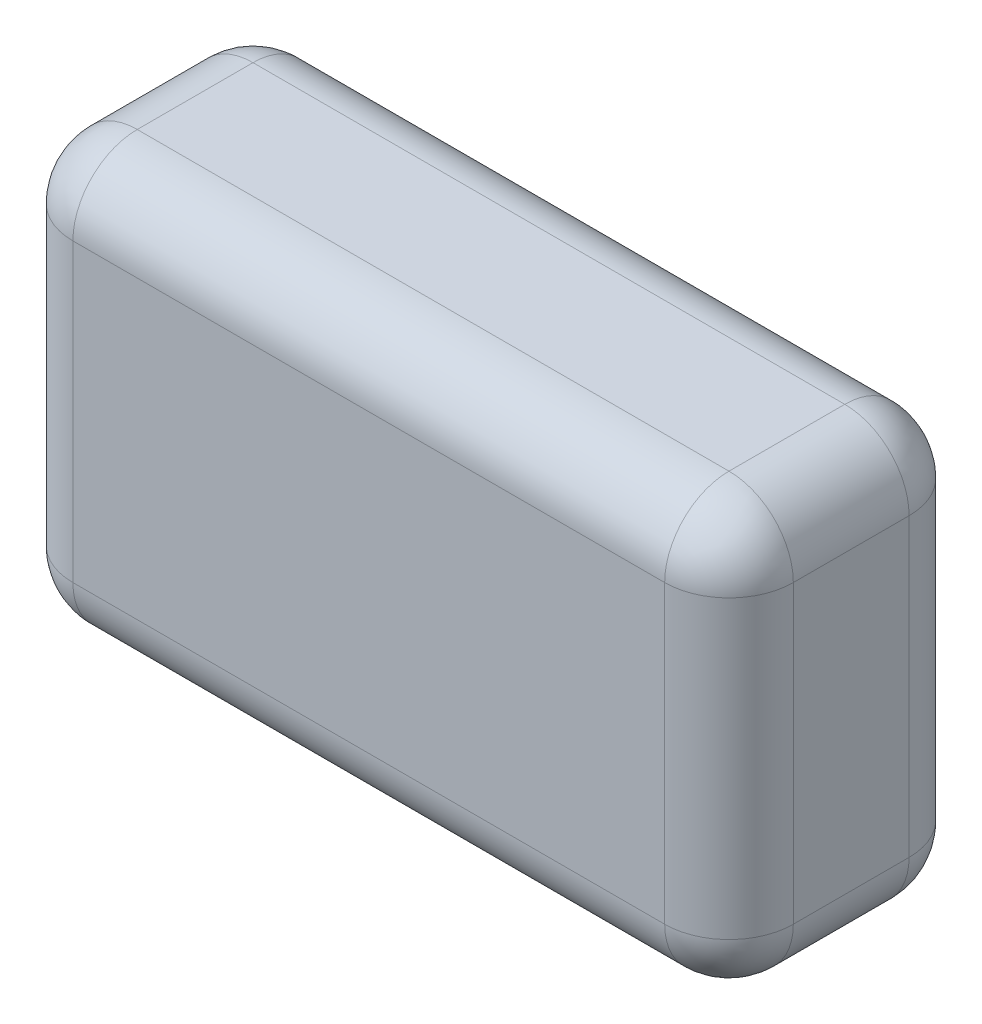
ISO-10303-21;
HEADER;
FILE_DESCRIPTION(('STEP AP214'),'2;1');
FILE_NAME('part.step','',(''),(''),'','','');
FILE_SCHEMA(('AUTOMOTIVE_DESIGN { 1 0 10303 214 1 1 1 1 }'));
ENDSEC;
DATA;
#1=APPLICATION_CONTEXT('core data for automotive mechanical design processes');
#2=APPLICATION_PROTOCOL_DEFINITION('international standard','automotive_design',2000,#1);
#3=PRODUCT_CONTEXT('',#1,'mechanical');
#4=PRODUCT('Part','Part','',(#3));
#5=PRODUCT_RELATED_PRODUCT_CATEGORY('part','',(#4));
#6=PRODUCT_DEFINITION_FORMATION('','',#4);
#7=PRODUCT_DEFINITION_CONTEXT('part definition',#1,'design');
#8=PRODUCT_DEFINITION('design','',#6,#7);
#9=PRODUCT_DEFINITION_SHAPE('','',#8);
#10=(LENGTH_UNIT() NAMED_UNIT(*) SI_UNIT(.MILLI.,.METRE.));
#11=(NAMED_UNIT(*) PLANE_ANGLE_UNIT() SI_UNIT($,.RADIAN.));
#12=(NAMED_UNIT(*) SI_UNIT($,.STERADIAN.) SOLID_ANGLE_UNIT());
#13=UNCERTAINTY_MEASURE_WITH_UNIT(LENGTH_MEASURE(1.E-05),#10,'distance_accuracy_value','');
#14=(GEOMETRIC_REPRESENTATION_CONTEXT(3) GLOBAL_UNCERTAINTY_ASSIGNED_CONTEXT((#13)) GLOBAL_UNIT_ASSIGNED_CONTEXT((#10,
#11,#12)) REPRESENTATION_CONTEXT('',''));
#15=CARTESIAN_POINT('',(0.,0.,0.));
#16=DIRECTION('',(0.,0.,1.));
#17=DIRECTION('',(1.,0.,0.));
#18=AXIS2_PLACEMENT_3D('',#15,#16,#17);
#19=CARTESIAN_POINT('',(46.,23.,38.));
#20=DIRECTION('',(0.,0.,-1.));
#21=DIRECTION('',(-1.,0.,0.));
#22=AXIS2_PLACEMENT_3D('',#19,#20,#21);
#23=CYLINDRICAL_SURFACE('',#22,10.);
#24=DIRECTION('',(0.,0.,-1.));
#25=VECTOR('',#24,1.);
#26=CARTESIAN_POINT('',(56.,23.,38.));
#27=LINE('',#26,#25);
#28=CARTESIAN_POINT('',(56.,23.,28.));
#29=VERTEX_POINT('',#28);
#30=CARTESIAN_POINT('',(56.,23.,10.));
#31=VERTEX_POINT('',#30);
#32=EDGE_CURVE('E261',#29,#31,#27,.T.);
#33=ORIENTED_EDGE('',*,*,#32,.T.);
#34=CARTESIAN_POINT('',(46.,23.,10.));
#35=DIRECTION('',(0.,0.,-1.));
#36=DIRECTION('',(-1.,0.,0.));
#37=AXIS2_PLACEMENT_3D('',#34,#35,#36);
#38=CIRCLE('',#37,10.);
#39=CARTESIAN_POINT('',(46.,33.,10.));
#40=VERTEX_POINT('',#39);
#41=EDGE_CURVE('E151',#31,#40,#38,.F.);
#42=ORIENTED_EDGE('',*,*,#41,.T.);
#43=DIRECTION('',(0.,0.,-1.));
#44=VECTOR('',#43,1.);
#45=CARTESIAN_POINT('',(46.,33.,38.));
#46=LINE('',#45,#44);
#47=CARTESIAN_POINT('',(46.,33.,28.));
#48=VERTEX_POINT('',#47);
#49=EDGE_CURVE('E133',#48,#40,#46,.T.);
#50=ORIENTED_EDGE('',*,*,#49,.F.);
#51=CARTESIAN_POINT('',(46.,23.,28.));
#52=DIRECTION('',(0.,0.,-1.));
#53=DIRECTION('',(-1.,0.,0.));
#54=AXIS2_PLACEMENT_3D('',#51,#52,#53);
#55=CIRCLE('',#54,10.);
#56=EDGE_CURVE('E148',#48,#29,#55,.T.);
#57=ORIENTED_EDGE('',*,*,#56,.T.);
#58=EDGE_LOOP('',(#33,#42,#50,#57));
#59=FACE_BOUND('',#58,.T.);
#60=ADVANCED_FACE('F39',(#59),#23,.T.);
#61=CARTESIAN_POINT('',(-46.,33.,38.));
#62=DIRECTION('',(0.,-1.,0.));
#63=DIRECTION('',(1.,0.,0.));
#64=AXIS2_PLACEMENT_3D('',#61,#62,#63);
#65=PLANE('',#64);
#66=ORIENTED_EDGE('',*,*,#49,.T.);
#67=DIRECTION('',(-1.,0.,0.));
#68=VECTOR('',#67,1.);
#69=CARTESIAN_POINT('',(-46.,33.,10.));
#70=LINE('',#69,#68);
#71=CARTESIAN_POINT('',(-46.,33.,10.));
#72=VERTEX_POINT('',#71);
#73=EDGE_CURVE('E141',#40,#72,#70,.T.);
#74=ORIENTED_EDGE('',*,*,#73,.T.);
#75=DIRECTION('',(0.,0.,-1.));
#76=VECTOR('',#75,1.);
#77=CARTESIAN_POINT('',(-46.,33.,38.));
#78=LINE('',#77,#76);
#79=CARTESIAN_POINT('',(-46.,33.,28.));
#80=VERTEX_POINT('',#79);
#81=EDGE_CURVE('E135',#80,#72,#78,.T.);
#82=ORIENTED_EDGE('',*,*,#81,.F.);
#83=DIRECTION('',(-1.,0.,0.));
#84=VECTOR('',#83,1.);
#85=CARTESIAN_POINT('',(-46.,33.,28.));
#86=LINE('',#85,#84);
#87=EDGE_CURVE('E130',#80,#48,#86,.F.);
#88=ORIENTED_EDGE('',*,*,#87,.T.);
#89=EDGE_LOOP('',(#66,#74,#82,#88));
#90=FACE_BOUND('',#89,.T.);
#91=ADVANCED_FACE('F132',(#90),#65,.F.);
#92=CARTESIAN_POINT('',(-46.,23.,38.));
#93=DIRECTION('',(0.,0.,-1.));
#94=DIRECTION('',(-1.,0.,0.));
#95=AXIS2_PLACEMENT_3D('',#92,#93,#94);
#96=CYLINDRICAL_SURFACE('',#95,10.);
#97=ORIENTED_EDGE('',*,*,#81,.T.);
#98=CARTESIAN_POINT('',(-46.,23.,10.));
#99=DIRECTION('',(0.,0.,-1.));
#100=DIRECTION('',(-1.,0.,0.));
#101=AXIS2_PLACEMENT_3D('',#98,#99,#100);
#102=CIRCLE('',#101,10.);
#103=CARTESIAN_POINT('',(-56.,23.,10.));
#104=VERTEX_POINT('',#103);
#105=EDGE_CURVE('E188',#72,#104,#102,.F.);
#106=ORIENTED_EDGE('',*,*,#105,.T.);
#107=DIRECTION('',(0.,0.,-1.));
#108=VECTOR('',#107,1.);
#109=CARTESIAN_POINT('',(-56.,23.,38.));
#110=LINE('',#109,#108);
#111=CARTESIAN_POINT('',(-56.,23.,28.));
#112=VERTEX_POINT('',#111);
#113=EDGE_CURVE('E294',#112,#104,#110,.T.);
#114=ORIENTED_EDGE('',*,*,#113,.F.);
#115=CARTESIAN_POINT('',(-46.,23.,28.));
#116=DIRECTION('',(0.,0.,-1.));
#117=DIRECTION('',(-1.,0.,0.));
#118=AXIS2_PLACEMENT_3D('',#115,#116,#117);
#119=CIRCLE('',#118,10.);
#120=EDGE_CURVE('E185',#112,#80,#119,.T.);
#121=ORIENTED_EDGE('',*,*,#120,.T.);
#122=EDGE_LOOP('',(#97,#106,#114,#121));
#123=FACE_BOUND('',#122,.T.);
#124=ADVANCED_FACE('F299',(#123),#96,.T.);
#125=CARTESIAN_POINT('',(-56.,23.,38.));
#126=DIRECTION('',(1.,0.,0.));
#127=DIRECTION('',(0.,0.,-1.));
#128=AXIS2_PLACEMENT_3D('',#125,#126,#127);
#129=PLANE('',#128);
#130=ORIENTED_EDGE('',*,*,#113,.T.);
#131=DIRECTION('',(0.,-1.,0.));
#132=VECTOR('',#131,1.);
#133=CARTESIAN_POINT('',(-56.,-23.,10.));
#134=LINE('',#133,#132);
#135=CARTESIAN_POINT('',(-56.,-23.,10.));
#136=VERTEX_POINT('',#135);
#137=EDGE_CURVE('E194',#104,#136,#134,.T.);
#138=ORIENTED_EDGE('',*,*,#137,.T.);
#139=DIRECTION('',(0.,0.,-1.));
#140=VECTOR('',#139,1.);
#141=CARTESIAN_POINT('',(-56.,-23.,38.));
#142=LINE('',#141,#140);
#143=CARTESIAN_POINT('',(-56.,-23.,28.));
#144=VERTEX_POINT('',#143);
#145=EDGE_CURVE('E297',#144,#136,#142,.T.);
#146=ORIENTED_EDGE('',*,*,#145,.F.);
#147=DIRECTION('',(0.,-1.,0.));
#148=VECTOR('',#147,1.);
#149=CARTESIAN_POINT('',(-56.,23.,28.));
#150=LINE('',#149,#148);
#151=EDGE_CURVE('E191',#144,#112,#150,.F.);
#152=ORIENTED_EDGE('',*,*,#151,.T.);
#153=EDGE_LOOP('',(#130,#138,#146,#152));
#154=FACE_BOUND('',#153,.T.);
#155=ADVANCED_FACE('F293',(#154),#129,.F.);
#156=CARTESIAN_POINT('',(-46.,-23.,38.));
#157=DIRECTION('',(0.,0.,-1.));
#158=DIRECTION('',(-1.,0.,0.));
#159=AXIS2_PLACEMENT_3D('',#156,#157,#158);
#160=CYLINDRICAL_SURFACE('',#159,10.);
#161=ORIENTED_EDGE('',*,*,#145,.T.);
#162=CARTESIAN_POINT('',(-46.,-23.,10.));
#163=DIRECTION('',(0.,0.,-1.));
#164=DIRECTION('',(-1.,0.,0.));
#165=AXIS2_PLACEMENT_3D('',#162,#163,#164);
#166=CIRCLE('',#165,10.);
#167=CARTESIAN_POINT('',(-46.,-33.,10.));
#168=VERTEX_POINT('',#167);
#169=EDGE_CURVE('E182',#136,#168,#166,.F.);
#170=ORIENTED_EDGE('',*,*,#169,.T.);
#171=DIRECTION('',(0.,0.,-1.));
#172=VECTOR('',#171,1.);
#173=CARTESIAN_POINT('',(-46.,-33.,38.));
#174=LINE('',#173,#172);
#175=CARTESIAN_POINT('',(-46.,-33.,28.));
#176=VERTEX_POINT('',#175);
#177=EDGE_CURVE('E305',#176,#168,#174,.T.);
#178=ORIENTED_EDGE('',*,*,#177,.F.);
#179=CARTESIAN_POINT('',(-46.,-23.,28.));
#180=DIRECTION('',(0.,0.,-1.));
#181=DIRECTION('',(-1.,0.,0.));
#182=AXIS2_PLACEMENT_3D('',#179,#180,#181);
#183=CIRCLE('',#182,10.);
#184=EDGE_CURVE('E179',#176,#144,#183,.T.);
#185=ORIENTED_EDGE('',*,*,#184,.T.);
#186=EDGE_LOOP('',(#161,#170,#178,#185));
#187=FACE_BOUND('',#186,.T.);
#188=ADVANCED_FACE('F354',(#187),#160,.T.);
#189=CARTESIAN_POINT('',(-46.,-33.,38.));
#190=DIRECTION('',(0.,1.,0.));
#191=DIRECTION('',(0.,0.,1.));
#192=AXIS2_PLACEMENT_3D('',#189,#190,#191);
#193=PLANE('',#192);
#194=ORIENTED_EDGE('',*,*,#177,.T.);
#195=DIRECTION('',(1.,0.,0.));
#196=VECTOR('',#195,1.);
#197=CARTESIAN_POINT('',(46.,-33.,10.));
#198=LINE('',#197,#196);
#199=CARTESIAN_POINT('',(46.,-33.,10.));
#200=VERTEX_POINT('',#199);
#201=EDGE_CURVE('E221',#168,#200,#198,.T.);
#202=ORIENTED_EDGE('',*,*,#201,.T.);
#203=DIRECTION('',(0.,0.,-1.));
#204=VECTOR('',#203,1.);
#205=CARTESIAN_POINT('',(46.,-33.,38.));
#206=LINE('',#205,#204);
#207=CARTESIAN_POINT('',(46.,-33.,28.));
#208=VERTEX_POINT('',#207);
#209=EDGE_CURVE('E311',#208,#200,#206,.T.);
#210=ORIENTED_EDGE('',*,*,#209,.F.);
#211=DIRECTION('',(1.,0.,0.));
#212=VECTOR('',#211,1.);
#213=CARTESIAN_POINT('',(-46.,-33.,28.));
#214=LINE('',#213,#212);
#215=EDGE_CURVE('E218',#208,#176,#214,.F.);
#216=ORIENTED_EDGE('',*,*,#215,.T.);
#217=EDGE_LOOP('',(#194,#202,#210,#216));
#218=FACE_BOUND('',#217,.T.);
#219=ADVANCED_FACE('F356',(#218),#193,.F.);
#220=CARTESIAN_POINT('',(46.,-23.,38.));
#221=DIRECTION('',(0.,0.,-1.));
#222=DIRECTION('',(-1.,0.,0.));
#223=AXIS2_PLACEMENT_3D('',#220,#221,#222);
#224=CYLINDRICAL_SURFACE('',#223,10.);
#225=ORIENTED_EDGE('',*,*,#209,.T.);
#226=CARTESIAN_POINT('',(46.,-23.,10.));
#227=DIRECTION('',(0.,0.,-1.));
#228=DIRECTION('',(-1.,0.,0.));
#229=AXIS2_PLACEMENT_3D('',#226,#227,#228);
#230=CIRCLE('',#229,10.);
#231=CARTESIAN_POINT('',(56.,-23.,10.));
#232=VERTEX_POINT('',#231);
#233=EDGE_CURVE('E176',#200,#232,#230,.F.);
#234=ORIENTED_EDGE('',*,*,#233,.T.);
#235=DIRECTION('',(0.,0.,-1.));
#236=VECTOR('',#235,1.);
#237=CARTESIAN_POINT('',(56.,-23.,38.));
#238=LINE('',#237,#236);
#239=CARTESIAN_POINT('',(56.,-23.,28.));
#240=VERTEX_POINT('',#239);
#241=EDGE_CURVE('E315',#240,#232,#238,.T.);
#242=ORIENTED_EDGE('',*,*,#241,.F.);
#243=CARTESIAN_POINT('',(46.,-23.,28.));
#244=DIRECTION('',(0.,0.,-1.));
#245=DIRECTION('',(-1.,0.,0.));
#246=AXIS2_PLACEMENT_3D('',#243,#244,#245);
#247=CIRCLE('',#246,10.);
#248=EDGE_CURVE('E170',#240,#208,#247,.T.);
#249=ORIENTED_EDGE('',*,*,#248,.T.);
#250=EDGE_LOOP('',(#225,#234,#242,#249));
#251=FACE_BOUND('',#250,.T.);
#252=ADVANCED_FACE('F377',(#251),#224,.T.);
#253=CARTESIAN_POINT('',(56.,23.,38.));
#254=DIRECTION('',(-1.,0.,0.));
#255=DIRECTION('',(0.,-1.,0.));
#256=AXIS2_PLACEMENT_3D('',#253,#254,#255);
#257=PLANE('',#256);
#258=ORIENTED_EDGE('',*,*,#241,.T.);
#259=DIRECTION('',(0.,1.,0.));
#260=VECTOR('',#259,1.);
#261=CARTESIAN_POINT('',(56.,23.,10.));
#262=LINE('',#261,#260);
#263=EDGE_CURVE('E215',#232,#31,#262,.T.);
#264=ORIENTED_EDGE('',*,*,#263,.T.);
#265=ORIENTED_EDGE('',*,*,#32,.F.);
#266=DIRECTION('',(0.,1.,0.));
#267=VECTOR('',#266,1.);
#268=CARTESIAN_POINT('',(56.,23.,28.));
#269=LINE('',#268,#267);
#270=EDGE_CURVE('E211',#29,#240,#269,.F.);
#271=ORIENTED_EDGE('',*,*,#270,.T.);
#272=EDGE_LOOP('',(#258,#264,#265,#271));
#273=FACE_BOUND('',#272,.T.);
#274=ADVANCED_FACE('F370',(#273),#257,.F.);
#275=CARTESIAN_POINT('',(46.,23.,38.));
#276=DIRECTION('',(0.,0.,-1.));
#277=DIRECTION('',(-1.,0.,0.));
#278=AXIS2_PLACEMENT_3D('',#275,#276,#277);
#279=PLANE('',#278);
#280=DIRECTION('',(1.,0.,0.));
#281=VECTOR('',#280,1.);
#282=CARTESIAN_POINT('',(46.,-23.,38.));
#283=LINE('',#282,#281);
#284=CARTESIAN_POINT('',(-46.,-23.,38.));
#285=VERTEX_POINT('',#284);
#286=CARTESIAN_POINT('',(46.,-23.,38.));
#287=VERTEX_POINT('',#286);
#288=EDGE_CURVE('E49',#285,#287,#283,.T.);
#289=ORIENTED_EDGE('',*,*,#288,.T.);
#290=DIRECTION('',(0.,1.,0.));
#291=VECTOR('',#290,1.);
#292=CARTESIAN_POINT('',(46.,23.,38.));
#293=LINE('',#292,#291);
#294=CARTESIAN_POINT('',(46.,23.,38.));
#295=VERTEX_POINT('',#294);
#296=EDGE_CURVE('E11',#287,#295,#293,.T.);
#297=ORIENTED_EDGE('',*,*,#296,.T.);
#298=DIRECTION('',(-1.,0.,0.));
#299=VECTOR('',#298,1.);
#300=CARTESIAN_POINT('',(46.,23.,38.));
#301=LINE('',#300,#299);
#302=CARTESIAN_POINT('',(-46.,23.,38.));
#303=VERTEX_POINT('',#302);
#304=EDGE_CURVE('E158',#295,#303,#301,.T.);
#305=ORIENTED_EDGE('',*,*,#304,.T.);
#306=DIRECTION('',(0.,-1.,0.));
#307=VECTOR('',#306,1.);
#308=CARTESIAN_POINT('',(-46.,23.,38.));
#309=LINE('',#308,#307);
#310=EDGE_CURVE('E60',#303,#285,#309,.T.);
#311=ORIENTED_EDGE('',*,*,#310,.T.);
#312=EDGE_LOOP('',(#289,#297,#305,#311));
#313=FACE_BOUND('',#312,.T.);
#314=ADVANCED_FACE('F368',(#313),#279,.F.);
#315=CARTESIAN_POINT('',(46.,23.,0.));
#316=DIRECTION('',(0.,0.,-1.));
#317=DIRECTION('',(-1.,0.,0.));
#318=AXIS2_PLACEMENT_3D('',#315,#316,#317);
#319=PLANE('',#318);
#320=DIRECTION('',(1.,0.,0.));
#321=VECTOR('',#320,1.);
#322=CARTESIAN_POINT('',(-46.,-23.,0.));
#323=LINE('',#322,#321);
#324=CARTESIAN_POINT('',(46.,-23.,0.));
#325=VERTEX_POINT('',#324);
#326=CARTESIAN_POINT('',(-46.,-23.,0.));
#327=VERTEX_POINT('',#326);
#328=EDGE_CURVE('E197',#325,#327,#323,.F.);
#329=ORIENTED_EDGE('',*,*,#328,.T.);
#330=DIRECTION('',(0.,-1.,0.));
#331=VECTOR('',#330,1.);
#332=CARTESIAN_POINT('',(-46.,23.,0.));
#333=LINE('',#332,#331);
#334=CARTESIAN_POINT('',(-46.,23.,0.));
#335=VERTEX_POINT('',#334);
#336=EDGE_CURVE('E142',#327,#335,#333,.F.);
#337=ORIENTED_EDGE('',*,*,#336,.T.);
#338=DIRECTION('',(-1.,0.,0.));
#339=VECTOR('',#338,1.);
#340=CARTESIAN_POINT('',(46.,23.,0.));
#341=LINE('',#340,#339);
#342=CARTESIAN_POINT('',(46.,23.,0.));
#343=VERTEX_POINT('',#342);
#344=EDGE_CURVE('E203',#335,#343,#341,.F.);
#345=ORIENTED_EDGE('',*,*,#344,.T.);
#346=DIRECTION('',(0.,1.,0.));
#347=VECTOR('',#346,1.);
#348=CARTESIAN_POINT('',(46.,-23.,0.));
#349=LINE('',#348,#347);
#350=EDGE_CURVE('E200',#343,#325,#349,.F.);
#351=ORIENTED_EDGE('',*,*,#350,.T.);
#352=EDGE_LOOP('',(#329,#337,#345,#351));
#353=FACE_BOUND('',#352,.T.);
#354=ADVANCED_FACE('F341',(#353),#319,.T.);
#355=CARTESIAN_POINT('',(-46.,-23.,10.));
#356=DIRECTION('',(0.,0.,-1.));
#357=DIRECTION('',(-1.,0.,0.));
#358=AXIS2_PLACEMENT_3D('',#355,#356,#357);
#359=SPHERICAL_SURFACE('',#358,10.);
#360=CARTESIAN_POINT('',(-46.,-23.,10.));
#361=DIRECTION('',(0.,1.,0.));
#362=DIRECTION('',(0.,0.,1.));
#363=AXIS2_PLACEMENT_3D('',#360,#361,#362);
#364=CIRCLE('',#363,10.);
#365=EDGE_CURVE('E253',#327,#136,#364,.T.);
#366=ORIENTED_EDGE('',*,*,#365,.F.);
#367=CARTESIAN_POINT('',(-46.,-23.,10.));
#368=DIRECTION('',(1.,0.,0.));
#369=DIRECTION('',(0.,0.,-1.));
#370=AXIS2_PLACEMENT_3D('',#367,#368,#369);
#371=CIRCLE('',#370,10.);
#372=EDGE_CURVE('E257',#168,#327,#371,.T.);
#373=ORIENTED_EDGE('',*,*,#372,.F.);
#374=ORIENTED_EDGE('',*,*,#169,.F.);
#375=EDGE_LOOP('',(#366,#373,#374));
#376=FACE_BOUND('',#375,.T.);
#377=ADVANCED_FACE('F351',(#376),#359,.T.);
#378=CARTESIAN_POINT('',(-46.,-23.,10.));
#379=DIRECTION('',(-1.,0.,0.));
#380=DIRECTION('',(0.,0.,1.));
#381=AXIS2_PLACEMENT_3D('',#378,#379,#380);
#382=CYLINDRICAL_SURFACE('',#381,10.);
#383=ORIENTED_EDGE('',*,*,#372,.T.);
#384=ORIENTED_EDGE('',*,*,#328,.F.);
#385=CARTESIAN_POINT('',(46.,-23.,10.));
#386=DIRECTION('',(1.,0.,0.));
#387=DIRECTION('',(0.,0.,-1.));
#388=AXIS2_PLACEMENT_3D('',#385,#386,#387);
#389=CIRCLE('',#388,10.);
#390=EDGE_CURVE('E249',#200,#325,#389,.T.);
#391=ORIENTED_EDGE('',*,*,#390,.F.);
#392=ORIENTED_EDGE('',*,*,#201,.F.);
#393=EDGE_LOOP('',(#383,#384,#391,#392));
#394=FACE_BOUND('',#393,.T.);
#395=ADVANCED_FACE('F348',(#394),#382,.T.);
#396=CARTESIAN_POINT('',(-46.,23.,10.));
#397=DIRECTION('',(0.,1.,0.));
#398=DIRECTION('',(0.,0.,1.));
#399=AXIS2_PLACEMENT_3D('',#396,#397,#398);
#400=CYLINDRICAL_SURFACE('',#399,10.);
#401=ORIENTED_EDGE('',*,*,#365,.T.);
#402=ORIENTED_EDGE('',*,*,#137,.F.);
#403=CARTESIAN_POINT('',(-46.,23.,10.));
#404=DIRECTION('',(0.,1.,0.));
#405=DIRECTION('',(0.,0.,1.));
#406=AXIS2_PLACEMENT_3D('',#403,#404,#405);
#407=CIRCLE('',#406,10.);
#408=EDGE_CURVE('E245',#335,#104,#407,.T.);
#409=ORIENTED_EDGE('',*,*,#408,.F.);
#410=ORIENTED_EDGE('',*,*,#336,.F.);
#411=EDGE_LOOP('',(#401,#402,#409,#410));
#412=FACE_BOUND('',#411,.T.);
#413=ADVANCED_FACE('F339',(#412),#400,.T.);
#414=CARTESIAN_POINT('',(46.,-23.,10.));
#415=DIRECTION('',(0.,0.,-1.));
#416=DIRECTION('',(-1.,0.,0.));
#417=AXIS2_PLACEMENT_3D('',#414,#415,#416);
#418=SPHERICAL_SURFACE('',#417,10.);
#419=ORIENTED_EDGE('',*,*,#233,.F.);
#420=ORIENTED_EDGE('',*,*,#390,.T.);
#421=CARTESIAN_POINT('',(46.,-23.,10.));
#422=DIRECTION('',(0.,1.,0.));
#423=DIRECTION('',(0.,0.,1.));
#424=AXIS2_PLACEMENT_3D('',#421,#422,#423);
#425=CIRCLE('',#424,10.);
#426=EDGE_CURVE('E241',#232,#325,#425,.T.);
#427=ORIENTED_EDGE('',*,*,#426,.F.);
#428=EDGE_LOOP('',(#419,#420,#427));
#429=FACE_BOUND('',#428,.T.);
#430=ADVANCED_FACE('F395',(#429),#418,.T.);
#431=CARTESIAN_POINT('',(-46.,23.,10.));
#432=DIRECTION('',(0.,0.,-1.));
#433=DIRECTION('',(-1.,0.,0.));
#434=AXIS2_PLACEMENT_3D('',#431,#432,#433);
#435=SPHERICAL_SURFACE('',#434,10.);
#436=ORIENTED_EDGE('',*,*,#408,.T.);
#437=ORIENTED_EDGE('',*,*,#105,.F.);
#438=CARTESIAN_POINT('',(-46.,23.,10.));
#439=DIRECTION('',(1.,0.,0.));
#440=DIRECTION('',(0.,0.,-1.));
#441=AXIS2_PLACEMENT_3D('',#438,#439,#440);
#442=CIRCLE('',#441,10.);
#443=EDGE_CURVE('E237',#335,#72,#442,.T.);
#444=ORIENTED_EDGE('',*,*,#443,.F.);
#445=EDGE_LOOP('',(#436,#437,#444));
#446=FACE_BOUND('',#445,.T.);
#447=ADVANCED_FACE('F335',(#446),#435,.T.);
#448=CARTESIAN_POINT('',(46.,23.,10.));
#449=DIRECTION('',(0.,-1.,0.));
#450=DIRECTION('',(1.,0.,0.));
#451=AXIS2_PLACEMENT_3D('',#448,#449,#450);
#452=CYLINDRICAL_SURFACE('',#451,10.);
#453=ORIENTED_EDGE('',*,*,#426,.T.);
#454=ORIENTED_EDGE('',*,*,#350,.F.);
#455=CARTESIAN_POINT('',(46.,23.,10.));
#456=DIRECTION('',(0.,1.,0.));
#457=DIRECTION('',(0.,0.,1.));
#458=AXIS2_PLACEMENT_3D('',#455,#456,#457);
#459=CIRCLE('',#458,10.);
#460=EDGE_CURVE('E233',#31,#343,#459,.T.);
#461=ORIENTED_EDGE('',*,*,#460,.F.);
#462=ORIENTED_EDGE('',*,*,#263,.F.);
#463=EDGE_LOOP('',(#453,#454,#461,#462));
#464=FACE_BOUND('',#463,.T.);
#465=ADVANCED_FACE('F326',(#464),#452,.T.);
#466=CARTESIAN_POINT('',(-46.,23.,10.));
#467=DIRECTION('',(1.,0.,0.));
#468=DIRECTION('',(0.,1.,0.));
#469=AXIS2_PLACEMENT_3D('',#466,#467,#468);
#470=CYLINDRICAL_SURFACE('',#469,10.);
#471=ORIENTED_EDGE('',*,*,#443,.T.);
#472=ORIENTED_EDGE('',*,*,#73,.F.);
#473=CARTESIAN_POINT('',(46.,23.,10.));
#474=DIRECTION('',(1.,0.,0.));
#475=DIRECTION('',(0.,0.,-1.));
#476=AXIS2_PLACEMENT_3D('',#473,#474,#475);
#477=CIRCLE('',#476,10.);
#478=EDGE_CURVE('E230',#343,#40,#477,.T.);
#479=ORIENTED_EDGE('',*,*,#478,.F.);
#480=ORIENTED_EDGE('',*,*,#344,.F.);
#481=EDGE_LOOP('',(#471,#472,#479,#480));
#482=FACE_BOUND('',#481,.T.);
#483=ADVANCED_FACE('F332',(#482),#470,.T.);
#484=CARTESIAN_POINT('',(46.,23.,10.));
#485=DIRECTION('',(0.,0.,-1.));
#486=DIRECTION('',(-1.,0.,0.));
#487=AXIS2_PLACEMENT_3D('',#484,#485,#486);
#488=SPHERICAL_SURFACE('',#487,10.);
#489=ORIENTED_EDGE('',*,*,#41,.F.);
#490=ORIENTED_EDGE('',*,*,#460,.T.);
#491=ORIENTED_EDGE('',*,*,#478,.T.);
#492=EDGE_LOOP('',(#489,#490,#491));
#493=FACE_BOUND('',#492,.T.);
#494=ADVANCED_FACE('F329',(#493),#488,.T.);
#495=CARTESIAN_POINT('',(-46.,23.,28.));
#496=DIRECTION('',(0.,-1.,0.));
#497=DIRECTION('',(0.,0.,-1.));
#498=AXIS2_PLACEMENT_3D('',#495,#496,#497);
#499=CYLINDRICAL_SURFACE('',#498,10.);
#500=CARTESIAN_POINT('',(-46.,23.,28.));
#501=DIRECTION('',(0.,1.,0.));
#502=DIRECTION('',(0.,0.,1.));
#503=AXIS2_PLACEMENT_3D('',#500,#501,#502);
#504=CIRCLE('',#503,10.);
#505=EDGE_CURVE('E275',#112,#303,#504,.T.);
#506=ORIENTED_EDGE('',*,*,#505,.F.);
#507=ORIENTED_EDGE('',*,*,#151,.F.);
#508=CARTESIAN_POINT('',(-46.,-23.,28.));
#509=DIRECTION('',(0.,-1.,0.));
#510=DIRECTION('',(0.,0.,-1.));
#511=AXIS2_PLACEMENT_3D('',#508,#509,#510);
#512=CIRCLE('',#511,10.);
#513=EDGE_CURVE('E43',#285,#144,#512,.T.);
#514=ORIENTED_EDGE('',*,*,#513,.F.);
#515=ORIENTED_EDGE('',*,*,#310,.F.);
#516=EDGE_LOOP('',(#506,#507,#514,#515));
#517=FACE_BOUND('',#516,.T.);
#518=ADVANCED_FACE('F41',(#517),#499,.T.);
#519=CARTESIAN_POINT('',(-46.,-23.,28.));
#520=DIRECTION('',(0.,0.,-1.));
#521=DIRECTION('',(-1.,0.,0.));
#522=AXIS2_PLACEMENT_3D('',#519,#520,#521);
#523=SPHERICAL_SURFACE('',#522,10.);
#524=ORIENTED_EDGE('',*,*,#513,.T.);
#525=ORIENTED_EDGE('',*,*,#184,.F.);
#526=CARTESIAN_POINT('',(-46.,-23.,28.));
#527=DIRECTION('',(1.,0.,0.));
#528=DIRECTION('',(0.,0.,-1.));
#529=AXIS2_PLACEMENT_3D('',#526,#527,#528);
#530=CIRCLE('',#529,10.);
#531=EDGE_CURVE('E272',#285,#176,#530,.T.);
#532=ORIENTED_EDGE('',*,*,#531,.F.);
#533=EDGE_LOOP('',(#524,#525,#532));
#534=FACE_BOUND('',#533,.T.);
#535=ADVANCED_FACE('F286',(#534),#523,.T.);
#536=CARTESIAN_POINT('',(-46.,23.,28.));
#537=DIRECTION('',(0.,0.,-1.));
#538=DIRECTION('',(-1.,0.,0.));
#539=AXIS2_PLACEMENT_3D('',#536,#537,#538);
#540=SPHERICAL_SURFACE('',#539,10.);
#541=ORIENTED_EDGE('',*,*,#120,.F.);
#542=ORIENTED_EDGE('',*,*,#505,.T.);
#543=CARTESIAN_POINT('',(-46.,23.,28.));
#544=DIRECTION('',(1.,0.,0.));
#545=DIRECTION('',(0.,0.,-1.));
#546=AXIS2_PLACEMENT_3D('',#543,#544,#545);
#547=CIRCLE('',#546,10.);
#548=EDGE_CURVE('E269',#80,#303,#547,.T.);
#549=ORIENTED_EDGE('',*,*,#548,.F.);
#550=EDGE_LOOP('',(#541,#542,#549));
#551=FACE_BOUND('',#550,.T.);
#552=ADVANCED_FACE('F415',(#551),#540,.T.);
#553=CARTESIAN_POINT('',(46.,-23.,28.));
#554=DIRECTION('',(1.,0.,0.));
#555=DIRECTION('',(0.,0.,-1.));
#556=AXIS2_PLACEMENT_3D('',#553,#554,#555);
#557=CYLINDRICAL_SURFACE('',#556,10.);
#558=ORIENTED_EDGE('',*,*,#531,.T.);
#559=ORIENTED_EDGE('',*,*,#215,.F.);
#560=CARTESIAN_POINT('',(46.,-23.,28.));
#561=DIRECTION('',(1.,0.,0.));
#562=DIRECTION('',(0.,0.,-1.));
#563=AXIS2_PLACEMENT_3D('',#560,#561,#562);
#564=CIRCLE('',#563,10.);
#565=EDGE_CURVE('E162',#287,#208,#564,.T.);
#566=ORIENTED_EDGE('',*,*,#565,.F.);
#567=ORIENTED_EDGE('',*,*,#288,.F.);
#568=EDGE_LOOP('',(#558,#559,#566,#567));
#569=FACE_BOUND('',#568,.T.);
#570=ADVANCED_FACE('F360',(#569),#557,.T.);
#571=CARTESIAN_POINT('',(46.,23.,28.));
#572=DIRECTION('',(-1.,0.,0.));
#573=DIRECTION('',(0.,-1.,0.));
#574=AXIS2_PLACEMENT_3D('',#571,#572,#573);
#575=CYLINDRICAL_SURFACE('',#574,10.);
#576=ORIENTED_EDGE('',*,*,#548,.T.);
#577=ORIENTED_EDGE('',*,*,#304,.F.);
#578=CARTESIAN_POINT('',(46.,23.,28.));
#579=DIRECTION('',(1.,0.,0.));
#580=DIRECTION('',(0.,0.,-1.));
#581=AXIS2_PLACEMENT_3D('',#578,#579,#580);
#582=CIRCLE('',#581,10.);
#583=EDGE_CURVE('E156',#48,#295,#582,.T.);
#584=ORIENTED_EDGE('',*,*,#583,.F.);
#585=ORIENTED_EDGE('',*,*,#87,.F.);
#586=EDGE_LOOP('',(#576,#577,#584,#585));
#587=FACE_BOUND('',#586,.T.);
#588=ADVANCED_FACE('F157',(#587),#575,.T.);
#589=CARTESIAN_POINT('',(46.,-23.,28.));
#590=DIRECTION('',(0.,0.,-1.));
#591=DIRECTION('',(-1.,0.,0.));
#592=AXIS2_PLACEMENT_3D('',#589,#590,#591);
#593=SPHERICAL_SURFACE('',#592,10.);
#594=ORIENTED_EDGE('',*,*,#565,.T.);
#595=ORIENTED_EDGE('',*,*,#248,.F.);
#596=CARTESIAN_POINT('',(46.,-23.,28.));
#597=DIRECTION('',(0.,1.,0.));
#598=DIRECTION('',(0.,0.,1.));
#599=AXIS2_PLACEMENT_3D('',#596,#597,#598);
#600=CIRCLE('',#599,10.);
#601=EDGE_CURVE('E163',#287,#240,#600,.T.);
#602=ORIENTED_EDGE('',*,*,#601,.F.);
#603=EDGE_LOOP('',(#594,#595,#602));
#604=FACE_BOUND('',#603,.T.);
#605=ADVANCED_FACE('F364',(#604),#593,.T.);
#606=CARTESIAN_POINT('',(46.,23.,28.));
#607=DIRECTION('',(0.,0.,-1.));
#608=DIRECTION('',(-1.,0.,0.));
#609=AXIS2_PLACEMENT_3D('',#606,#607,#608);
#610=SPHERICAL_SURFACE('',#609,10.);
#611=ORIENTED_EDGE('',*,*,#56,.F.);
#612=ORIENTED_EDGE('',*,*,#583,.T.);
#613=CARTESIAN_POINT('',(46.,23.,28.));
#614=DIRECTION('',(0.,-1.,0.));
#615=DIRECTION('',(0.,0.,-1.));
#616=AXIS2_PLACEMENT_3D('',#613,#614,#615);
#617=CIRCLE('',#616,10.);
#618=EDGE_CURVE('E166',#29,#295,#617,.T.);
#619=ORIENTED_EDGE('',*,*,#618,.F.);
#620=EDGE_LOOP('',(#611,#612,#619));
#621=FACE_BOUND('',#620,.T.);
#622=ADVANCED_FACE('F165',(#621),#610,.T.);
#623=CARTESIAN_POINT('',(46.,23.,28.));
#624=DIRECTION('',(0.,1.,0.));
#625=DIRECTION('',(-1.,0.,0.));
#626=AXIS2_PLACEMENT_3D('',#623,#624,#625);
#627=CYLINDRICAL_SURFACE('',#626,10.);
#628=ORIENTED_EDGE('',*,*,#601,.T.);
#629=ORIENTED_EDGE('',*,*,#270,.F.);
#630=ORIENTED_EDGE('',*,*,#618,.T.);
#631=ORIENTED_EDGE('',*,*,#296,.F.);
#632=EDGE_LOOP('',(#628,#629,#630,#631));
#633=FACE_BOUND('',#632,.T.);
#634=ADVANCED_FACE('F367',(#633),#627,.T.);
#635=CLOSED_SHELL('',(#60,#91,#124,#155,#188,#219,#252,#274,#314,#354,#377,#395,#413,#430,#447,
#465,#483,#494,#518,#535,#552,#570,#588,#605,#622,#634));
#636=MANIFOLD_SOLID_BREP('B2',#635);
#637=ADVANCED_BREP_SHAPE_REPRESENTATION('',(#18,#636),#14);
#638=SHAPE_DEFINITION_REPRESENTATION(#9,#637);
ENDSEC;
END-ISO-10303-21;
